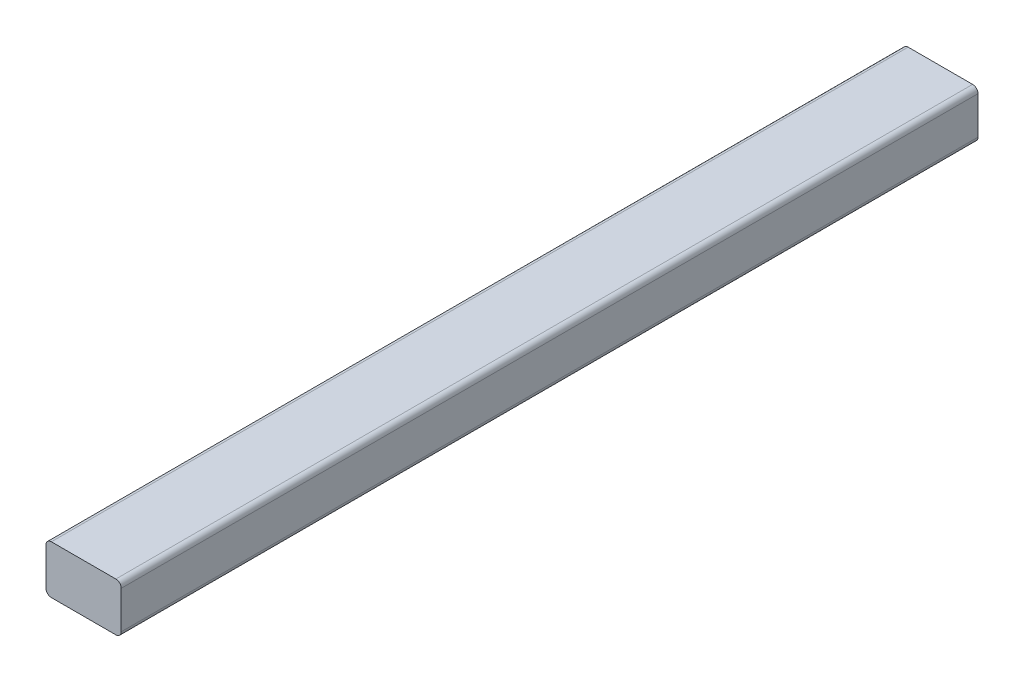
ISO-10303-21;
HEADER;
FILE_DESCRIPTION(('STEP AP214'),'2;1');
FILE_NAME('part.step','',(''),(''),'','','');
FILE_SCHEMA(('AUTOMOTIVE_DESIGN { 1 0 10303 214 1 1 1 1 }'));
ENDSEC;
DATA;
#1=APPLICATION_CONTEXT('core data for automotive mechanical design processes');
#2=APPLICATION_PROTOCOL_DEFINITION('international standard','automotive_design',2000,#1);
#3=PRODUCT_CONTEXT('',#1,'mechanical');
#4=PRODUCT('Part','Part','',(#3));
#5=PRODUCT_RELATED_PRODUCT_CATEGORY('part','',(#4));
#6=PRODUCT_DEFINITION_FORMATION('','',#4);
#7=PRODUCT_DEFINITION_CONTEXT('part definition',#1,'design');
#8=PRODUCT_DEFINITION('design','',#6,#7);
#9=PRODUCT_DEFINITION_SHAPE('','',#8);
#10=(LENGTH_UNIT() NAMED_UNIT(*) SI_UNIT(.MILLI.,.METRE.));
#11=(NAMED_UNIT(*) PLANE_ANGLE_UNIT() SI_UNIT($,.RADIAN.));
#12=(NAMED_UNIT(*) SI_UNIT($,.STERADIAN.) SOLID_ANGLE_UNIT());
#13=UNCERTAINTY_MEASURE_WITH_UNIT(LENGTH_MEASURE(1.E-05),#10,'distance_accuracy_value','');
#14=(GEOMETRIC_REPRESENTATION_CONTEXT(3) GLOBAL_UNCERTAINTY_ASSIGNED_CONTEXT((#13)) GLOBAL_UNIT_ASSIGNED_CONTEXT((#10,
#11,#12)) REPRESENTATION_CONTEXT('',''));
#15=CARTESIAN_POINT('',(0.,0.,0.));
#16=DIRECTION('',(0.,0.,1.));
#17=DIRECTION('',(1.,0.,0.));
#18=AXIS2_PLACEMENT_3D('',#15,#16,#17);
#19=CARTESIAN_POINT('',(-32.6321098350361,-9.43423390932888,797.));
#20=DIRECTION('',(0.,0.,-1.));
#21=DIRECTION('',(-1.,0.,0.));
#22=AXIS2_PLACEMENT_3D('',#19,#20,#21);
#23=CYLINDRICAL_SURFACE('',#22,5.);
#24=CARTESIAN_POINT('',(-32.6321098350361,-9.43423390932888,0.));
#25=DIRECTION('',(0.,0.,1.));
#26=DIRECTION('',(1.,0.,0.));
#27=AXIS2_PLACEMENT_3D('',#24,#25,#26);
#28=CIRCLE('',#27,5.);
#29=CARTESIAN_POINT('',(-37.6321098350361,-9.43423390932885,0.));
#30=VERTEX_POINT('',#29);
#31=CARTESIAN_POINT('',(-32.632109835036,-14.4342339093289,0.));
#32=VERTEX_POINT('',#31);
#33=EDGE_CURVE('E128',#30,#32,#28,.T.);
#34=ORIENTED_EDGE('',*,*,#33,.T.);
#35=DIRECTION('',(0.,0.,-1.));
#36=VECTOR('',#35,1.);
#37=CARTESIAN_POINT('',(-32.632109835036,-14.4342339093289,797.));
#38=LINE('',#37,#36);
#39=CARTESIAN_POINT('',(-32.632109835036,-14.4342339093289,797.));
#40=VERTEX_POINT('',#39);
#41=EDGE_CURVE('E11',#40,#32,#38,.T.);
#42=ORIENTED_EDGE('',*,*,#41,.F.);
#43=CARTESIAN_POINT('',(-32.6321098350361,-9.43423390932888,797.));
#44=DIRECTION('',(0.,0.,1.));
#45=DIRECTION('',(1.,0.,0.));
#46=AXIS2_PLACEMENT_3D('',#43,#44,#45);
#47=CIRCLE('',#46,5.);
#48=CARTESIAN_POINT('',(-37.6321098350361,-9.43423390932885,797.));
#49=VERTEX_POINT('',#48);
#50=EDGE_CURVE('E142',#49,#40,#47,.T.);
#51=ORIENTED_EDGE('',*,*,#50,.F.);
#52=DIRECTION('',(0.,0.,-1.));
#53=VECTOR('',#52,1.);
#54=CARTESIAN_POINT('',(-37.6321098350361,-9.43423390932885,797.));
#55=LINE('',#54,#53);
#56=EDGE_CURVE('E124',#49,#30,#55,.T.);
#57=ORIENTED_EDGE('',*,*,#56,.T.);
#58=EDGE_LOOP('',(#34,#42,#51,#57));
#59=FACE_BOUND('',#58,.T.);
#60=ADVANCED_FACE('F32',(#59),#23,.T.);
#61=CARTESIAN_POINT('',(-32.632109835036,-14.4342339093289,797.));
#62=DIRECTION('',(0.,1.,0.));
#63=DIRECTION('',(0.,0.,1.));
#64=AXIS2_PLACEMENT_3D('',#61,#62,#63);
#65=PLANE('',#64);
#66=DIRECTION('',(1.,0.,0.));
#67=VECTOR('',#66,1.);
#68=CARTESIAN_POINT('',(-32.632109835036,-14.4342339093289,0.));
#69=LINE('',#68,#67);
#70=CARTESIAN_POINT('',(27.3678901649639,-14.4342339093289,0.));
#71=VERTEX_POINT('',#70);
#72=EDGE_CURVE('E131',#32,#71,#69,.T.);
#73=ORIENTED_EDGE('',*,*,#72,.T.);
#74=DIRECTION('',(0.,0.,-1.));
#75=VECTOR('',#74,1.);
#76=CARTESIAN_POINT('',(27.3678901649639,-14.4342339093289,797.));
#77=LINE('',#76,#75);
#78=CARTESIAN_POINT('',(27.3678901649639,-14.4342339093289,797.));
#79=VERTEX_POINT('',#78);
#80=EDGE_CURVE('E40',#79,#71,#77,.T.);
#81=ORIENTED_EDGE('',*,*,#80,.F.);
#82=DIRECTION('',(1.,0.,0.));
#83=VECTOR('',#82,1.);
#84=CARTESIAN_POINT('',(-32.632109835036,-14.4342339093289,797.));
#85=LINE('',#84,#83);
#86=EDGE_CURVE('E91',#40,#79,#85,.T.);
#87=ORIENTED_EDGE('',*,*,#86,.F.);
#88=ORIENTED_EDGE('',*,*,#41,.T.);
#89=EDGE_LOOP('',(#73,#81,#87,#88));
#90=FACE_BOUND('',#89,.T.);
#91=ADVANCED_FACE('F177',(#90),#65,.F.);
#92=CARTESIAN_POINT('',(27.3678901649639,-9.43423390932888,797.));
#93=DIRECTION('',(0.,0.,-1.));
#94=DIRECTION('',(-1.,0.,0.));
#95=AXIS2_PLACEMENT_3D('',#92,#93,#94);
#96=CYLINDRICAL_SURFACE('',#95,5.);
#97=CARTESIAN_POINT('',(27.3678901649639,-9.43423390932888,0.));
#98=DIRECTION('',(0.,0.,1.));
#99=DIRECTION('',(1.,0.,0.));
#100=AXIS2_PLACEMENT_3D('',#97,#98,#99);
#101=CIRCLE('',#100,5.);
#102=CARTESIAN_POINT('',(32.3678901649639,-9.43423390932885,0.));
#103=VERTEX_POINT('',#102);
#104=EDGE_CURVE('E133',#71,#103,#101,.T.);
#105=ORIENTED_EDGE('',*,*,#104,.T.);
#106=DIRECTION('',(0.,0.,-1.));
#107=VECTOR('',#106,1.);
#108=CARTESIAN_POINT('',(32.3678901649639,-9.43423390932885,797.));
#109=LINE('',#108,#107);
#110=CARTESIAN_POINT('',(32.3678901649639,-9.43423390932885,797.));
#111=VERTEX_POINT('',#110);
#112=EDGE_CURVE('E149',#111,#103,#109,.T.);
#113=ORIENTED_EDGE('',*,*,#112,.F.);
#114=CARTESIAN_POINT('',(27.3678901649639,-9.43423390932888,797.));
#115=DIRECTION('',(0.,0.,1.));
#116=DIRECTION('',(1.,0.,0.));
#117=AXIS2_PLACEMENT_3D('',#114,#115,#116);
#118=CIRCLE('',#117,5.);
#119=EDGE_CURVE('E157',#79,#111,#118,.T.);
#120=ORIENTED_EDGE('',*,*,#119,.F.);
#121=ORIENTED_EDGE('',*,*,#80,.T.);
#122=EDGE_LOOP('',(#105,#113,#120,#121));
#123=FACE_BOUND('',#122,.T.);
#124=ADVANCED_FACE('F155',(#123),#96,.T.);
#125=CARTESIAN_POINT('',(32.3678901649639,-9.43423390932885,797.));
#126=DIRECTION('',(-1.,0.,0.));
#127=DIRECTION('',(0.,0.,1.));
#128=AXIS2_PLACEMENT_3D('',#125,#126,#127);
#129=PLANE('',#128);
#130=DIRECTION('',(0.,1.,0.));
#131=VECTOR('',#130,1.);
#132=CARTESIAN_POINT('',(32.3678901649639,-9.43423390932885,0.));
#133=LINE('',#132,#131);
#134=CARTESIAN_POINT('',(32.3678901649639,25.5657660906711,0.));
#135=VERTEX_POINT('',#134);
#136=EDGE_CURVE('E135',#103,#135,#133,.T.);
#137=ORIENTED_EDGE('',*,*,#136,.T.);
#138=DIRECTION('',(0.,0.,-1.));
#139=VECTOR('',#138,1.);
#140=CARTESIAN_POINT('',(32.3678901649639,25.5657660906711,797.));
#141=LINE('',#140,#139);
#142=CARTESIAN_POINT('',(32.3678901649639,25.5657660906711,797.));
#143=VERTEX_POINT('',#142);
#144=EDGE_CURVE('E146',#143,#135,#141,.T.);
#145=ORIENTED_EDGE('',*,*,#144,.F.);
#146=DIRECTION('',(0.,1.,0.));
#147=VECTOR('',#146,1.);
#148=CARTESIAN_POINT('',(32.3678901649639,-9.43423390932885,797.));
#149=LINE('',#148,#147);
#150=EDGE_CURVE('E169',#111,#143,#149,.T.);
#151=ORIENTED_EDGE('',*,*,#150,.F.);
#152=ORIENTED_EDGE('',*,*,#112,.T.);
#153=EDGE_LOOP('',(#137,#145,#151,#152));
#154=FACE_BOUND('',#153,.T.);
#155=ADVANCED_FACE('F165',(#154),#129,.F.);
#156=CARTESIAN_POINT('',(27.3678901649639,25.5657660906711,797.));
#157=DIRECTION('',(0.,0.,-1.));
#158=DIRECTION('',(-1.,0.,0.));
#159=AXIS2_PLACEMENT_3D('',#156,#157,#158);
#160=CYLINDRICAL_SURFACE('',#159,5.);
#161=CARTESIAN_POINT('',(27.3678901649639,25.5657660906711,0.));
#162=DIRECTION('',(0.,0.,1.));
#163=DIRECTION('',(1.,0.,0.));
#164=AXIS2_PLACEMENT_3D('',#161,#162,#163);
#165=CIRCLE('',#164,5.);
#166=CARTESIAN_POINT('',(27.3678901649639,30.5657660906711,0.));
#167=VERTEX_POINT('',#166);
#168=EDGE_CURVE('E137',#135,#167,#165,.T.);
#169=ORIENTED_EDGE('',*,*,#168,.T.);
#170=DIRECTION('',(0.,0.,-1.));
#171=VECTOR('',#170,1.);
#172=CARTESIAN_POINT('',(27.3678901649639,30.5657660906711,797.));
#173=LINE('',#172,#171);
#174=CARTESIAN_POINT('',(27.3678901649639,30.5657660906711,797.));
#175=VERTEX_POINT('',#174);
#176=EDGE_CURVE('E119',#175,#167,#173,.T.);
#177=ORIENTED_EDGE('',*,*,#176,.F.);
#178=CARTESIAN_POINT('',(27.3678901649639,25.5657660906711,797.));
#179=DIRECTION('',(0.,0.,1.));
#180=DIRECTION('',(1.,0.,0.));
#181=AXIS2_PLACEMENT_3D('',#178,#179,#180);
#182=CIRCLE('',#181,5.);
#183=EDGE_CURVE('E110',#143,#175,#182,.T.);
#184=ORIENTED_EDGE('',*,*,#183,.F.);
#185=ORIENTED_EDGE('',*,*,#144,.T.);
#186=EDGE_LOOP('',(#169,#177,#184,#185));
#187=FACE_BOUND('',#186,.T.);
#188=ADVANCED_FACE('F168',(#187),#160,.T.);
#189=CARTESIAN_POINT('',(27.3678901649639,30.5657660906711,797.));
#190=DIRECTION('',(0.,-1.,0.));
#191=DIRECTION('',(0.,0.,-1.));
#192=AXIS2_PLACEMENT_3D('',#189,#190,#191);
#193=PLANE('',#192);
#194=DIRECTION('',(-1.,0.,0.));
#195=VECTOR('',#194,1.);
#196=CARTESIAN_POINT('',(27.3678901649639,30.5657660906711,0.));
#197=LINE('',#196,#195);
#198=CARTESIAN_POINT('',(-32.632109835036,30.5657660906711,0.));
#199=VERTEX_POINT('',#198);
#200=EDGE_CURVE('E118',#167,#199,#197,.T.);
#201=ORIENTED_EDGE('',*,*,#200,.T.);
#202=DIRECTION('',(0.,0.,-1.));
#203=VECTOR('',#202,1.);
#204=CARTESIAN_POINT('',(-32.632109835036,30.5657660906711,797.));
#205=LINE('',#204,#203);
#206=CARTESIAN_POINT('',(-32.632109835036,30.5657660906711,797.));
#207=VERTEX_POINT('',#206);
#208=EDGE_CURVE('E115',#207,#199,#205,.T.);
#209=ORIENTED_EDGE('',*,*,#208,.F.);
#210=DIRECTION('',(-1.,0.,0.));
#211=VECTOR('',#210,1.);
#212=CARTESIAN_POINT('',(27.3678901649639,30.5657660906711,797.));
#213=LINE('',#212,#211);
#214=EDGE_CURVE('E104',#175,#207,#213,.T.);
#215=ORIENTED_EDGE('',*,*,#214,.F.);
#216=ORIENTED_EDGE('',*,*,#176,.T.);
#217=EDGE_LOOP('',(#201,#209,#215,#216));
#218=FACE_BOUND('',#217,.T.);
#219=ADVANCED_FACE('F116',(#218),#193,.F.);
#220=CARTESIAN_POINT('',(-32.6321098350361,25.5657660906711,797.));
#221=DIRECTION('',(0.,0.,-1.));
#222=DIRECTION('',(-1.,0.,0.));
#223=AXIS2_PLACEMENT_3D('',#220,#221,#222);
#224=CYLINDRICAL_SURFACE('',#223,5.);
#225=CARTESIAN_POINT('',(-32.6321098350361,25.5657660906711,0.));
#226=DIRECTION('',(0.,0.,1.));
#227=DIRECTION('',(1.,0.,0.));
#228=AXIS2_PLACEMENT_3D('',#225,#226,#227);
#229=CIRCLE('',#228,5.);
#230=CARTESIAN_POINT('',(-37.6321098350361,25.5657660906711,0.));
#231=VERTEX_POINT('',#230);
#232=EDGE_CURVE('E77',#199,#231,#229,.T.);
#233=ORIENTED_EDGE('',*,*,#232,.T.);
#234=DIRECTION('',(0.,0.,-1.));
#235=VECTOR('',#234,1.);
#236=CARTESIAN_POINT('',(-37.6321098350361,25.5657660906711,797.));
#237=LINE('',#236,#235);
#238=CARTESIAN_POINT('',(-37.6321098350361,25.5657660906711,797.));
#239=VERTEX_POINT('',#238);
#240=EDGE_CURVE('E120',#239,#231,#237,.T.);
#241=ORIENTED_EDGE('',*,*,#240,.F.);
#242=CARTESIAN_POINT('',(-32.6321098350361,25.5657660906711,797.));
#243=DIRECTION('',(0.,0.,1.));
#244=DIRECTION('',(1.,0.,0.));
#245=AXIS2_PLACEMENT_3D('',#242,#243,#244);
#246=CIRCLE('',#245,5.);
#247=EDGE_CURVE('E108',#207,#239,#246,.T.);
#248=ORIENTED_EDGE('',*,*,#247,.F.);
#249=ORIENTED_EDGE('',*,*,#208,.T.);
#250=EDGE_LOOP('',(#233,#241,#248,#249));
#251=FACE_BOUND('',#250,.T.);
#252=ADVANCED_FACE('F122',(#251),#224,.T.);
#253=CARTESIAN_POINT('',(-37.6321098350361,25.5657660906711,797.));
#254=DIRECTION('',(1.,0.,0.));
#255=DIRECTION('',(0.,0.,-1.));
#256=AXIS2_PLACEMENT_3D('',#253,#254,#255);
#257=PLANE('',#256);
#258=DIRECTION('',(0.,-1.,0.));
#259=VECTOR('',#258,1.);
#260=CARTESIAN_POINT('',(-37.6321098350361,25.5657660906711,0.));
#261=LINE('',#260,#259);
#262=EDGE_CURVE('E83',#231,#30,#261,.T.);
#263=ORIENTED_EDGE('',*,*,#262,.T.);
#264=ORIENTED_EDGE('',*,*,#56,.F.);
#265=DIRECTION('',(0.,-1.,0.));
#266=VECTOR('',#265,1.);
#267=CARTESIAN_POINT('',(-37.6321098350361,25.5657660906711,797.));
#268=LINE('',#267,#266);
#269=EDGE_CURVE('E48',#239,#49,#268,.T.);
#270=ORIENTED_EDGE('',*,*,#269,.F.);
#271=ORIENTED_EDGE('',*,*,#240,.T.);
#272=EDGE_LOOP('',(#263,#264,#270,#271));
#273=FACE_BOUND('',#272,.T.);
#274=ADVANCED_FACE('F193',(#273),#257,.F.);
#275=CARTESIAN_POINT('',(-32.6321098350361,-9.43423390932888,797.));
#276=DIRECTION('',(0.,0.,1.));
#277=DIRECTION('',(1.,0.,0.));
#278=AXIS2_PLACEMENT_3D('',#275,#276,#277);
#279=PLANE('',#278);
#280=ORIENTED_EDGE('',*,*,#50,.T.);
#281=ORIENTED_EDGE('',*,*,#86,.T.);
#282=ORIENTED_EDGE('',*,*,#119,.T.);
#283=ORIENTED_EDGE('',*,*,#150,.T.);
#284=ORIENTED_EDGE('',*,*,#183,.T.);
#285=ORIENTED_EDGE('',*,*,#214,.T.);
#286=ORIENTED_EDGE('',*,*,#247,.T.);
#287=ORIENTED_EDGE('',*,*,#269,.T.);
#288=EDGE_LOOP('',(#280,#281,#282,#283,#284,#285,#286,#287));
#289=FACE_BOUND('',#288,.T.);
#290=ADVANCED_FACE('F106',(#289),#279,.T.);
#291=CARTESIAN_POINT('',(-32.6321098350361,-9.43423390932888,0.));
#292=DIRECTION('',(0.,0.,1.));
#293=DIRECTION('',(1.,0.,0.));
#294=AXIS2_PLACEMENT_3D('',#291,#292,#293);
#295=PLANE('',#294);
#296=ORIENTED_EDGE('',*,*,#33,.F.);
#297=ORIENTED_EDGE('',*,*,#262,.F.);
#298=ORIENTED_EDGE('',*,*,#232,.F.);
#299=ORIENTED_EDGE('',*,*,#200,.F.);
#300=ORIENTED_EDGE('',*,*,#168,.F.);
#301=ORIENTED_EDGE('',*,*,#136,.F.);
#302=ORIENTED_EDGE('',*,*,#104,.F.);
#303=ORIENTED_EDGE('',*,*,#72,.F.);
#304=EDGE_LOOP('',(#296,#297,#298,#299,#300,#301,#302,#303));
#305=FACE_BOUND('',#304,.T.);
#306=ADVANCED_FACE('F161',(#305),#295,.F.);
#307=CLOSED_SHELL('',(#60,#91,#124,#155,#188,#219,#252,#274,#290,#306));
#308=MANIFOLD_SOLID_BREP('B2',#307);
#309=ADVANCED_BREP_SHAPE_REPRESENTATION('',(#18,#308),#14);
#310=SHAPE_DEFINITION_REPRESENTATION(#9,#309);
ENDSEC;
END-ISO-10303-21;
